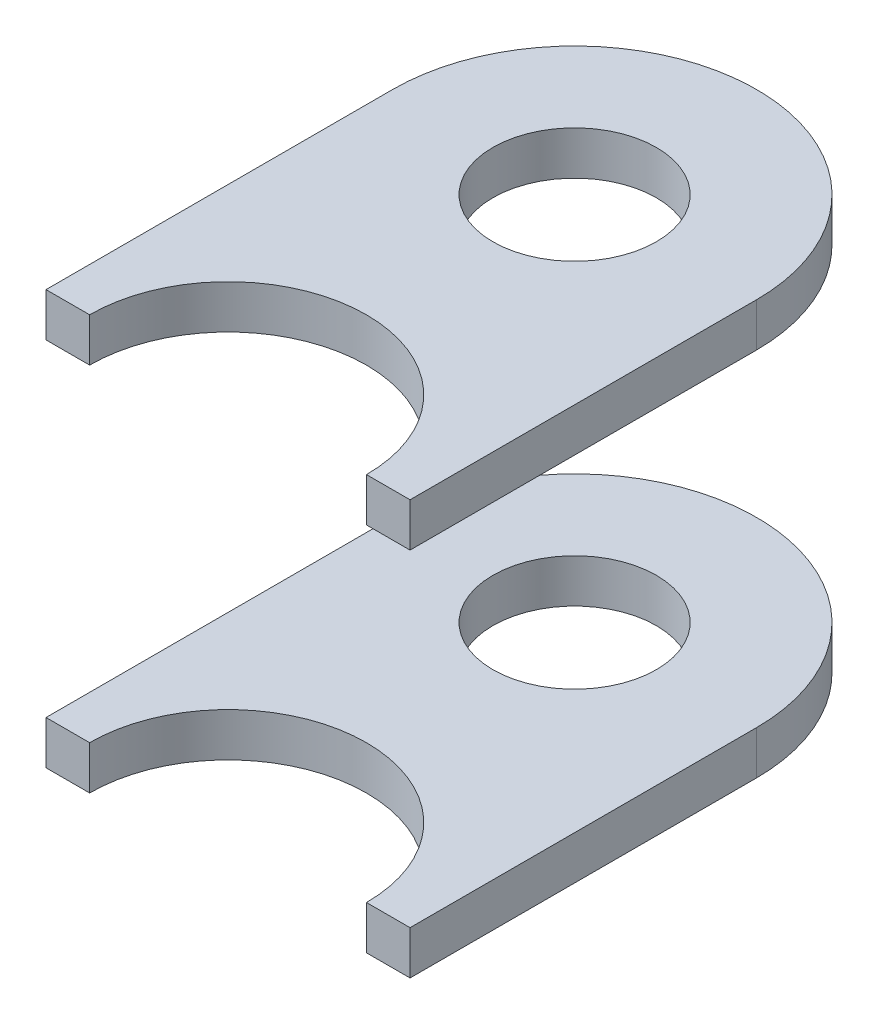
ISO-10303-21;
HEADER;
FILE_DESCRIPTION(('STEP AP214'),'2;1');
FILE_NAME('part.step','',(''),(''),'','','');
FILE_SCHEMA(('AUTOMOTIVE_DESIGN { 1 0 10303 214 1 1 1 1 }'));
ENDSEC;
DATA;
#1=APPLICATION_CONTEXT('core data for automotive mechanical design processes');
#2=APPLICATION_PROTOCOL_DEFINITION('international standard','automotive_design',2000,#1);
#3=PRODUCT_CONTEXT('',#1,'mechanical');
#4=PRODUCT('Part','Part','',(#3));
#5=PRODUCT_RELATED_PRODUCT_CATEGORY('part','',(#4));
#6=PRODUCT_DEFINITION_FORMATION('','',#4);
#7=PRODUCT_DEFINITION_CONTEXT('part definition',#1,'design');
#8=PRODUCT_DEFINITION('design','',#6,#7);
#9=PRODUCT_DEFINITION_SHAPE('','',#8);
#10=(LENGTH_UNIT() NAMED_UNIT(*) SI_UNIT(.MILLI.,.METRE.));
#11=(NAMED_UNIT(*) PLANE_ANGLE_UNIT() SI_UNIT($,.RADIAN.));
#12=(NAMED_UNIT(*) SI_UNIT($,.STERADIAN.) SOLID_ANGLE_UNIT());
#13=UNCERTAINTY_MEASURE_WITH_UNIT(LENGTH_MEASURE(1.E-05),#10,'distance_accuracy_value','');
#14=(GEOMETRIC_REPRESENTATION_CONTEXT(3) GLOBAL_UNCERTAINTY_ASSIGNED_CONTEXT((#13)) GLOBAL_UNIT_ASSIGNED_CONTEXT((#10,
#11,#12)) REPRESENTATION_CONTEXT('',''));
#15=CARTESIAN_POINT('',(0.,0.,0.));
#16=DIRECTION('',(0.,0.,1.));
#17=DIRECTION('',(1.,0.,0.));
#18=AXIS2_PLACEMENT_3D('',#15,#16,#17);
#19=CARTESIAN_POINT('',(0.,-19.,31.8));
#20=DIRECTION('',(0.,-1.,0.));
#21=DIRECTION('',(0.,0.,1.));
#22=AXIS2_PLACEMENT_3D('',#19,#20,#21);
#23=PLANE('',#22);
#24=DIRECTION('',(0.,0.,-1.));
#25=VECTOR('',#24,1.);
#26=CARTESIAN_POINT('',(16.7,-19.,0.));
#27=LINE('',#26,#25);
#28=CARTESIAN_POINT('',(16.7,-19.,31.8));
#29=VERTEX_POINT('',#28);
#30=CARTESIAN_POINT('',(16.7,-19.,0.));
#31=VERTEX_POINT('',#30);
#32=EDGE_CURVE('E149',#29,#31,#27,.T.);
#33=ORIENTED_EDGE('',*,*,#32,.F.);
#34=DIRECTION('',(1.,0.,0.));
#35=VECTOR('',#34,1.);
#36=CARTESIAN_POINT('',(16.7,-19.,31.8));
#37=LINE('',#36,#35);
#38=CARTESIAN_POINT('',(12.7,-19.,31.8));
#39=VERTEX_POINT('',#38);
#40=EDGE_CURVE('E129',#39,#29,#37,.T.);
#41=ORIENTED_EDGE('',*,*,#40,.F.);
#42=CARTESIAN_POINT('',(0.,-19.,31.8));
#43=DIRECTION('',(0.,-1.,0.));
#44=DIRECTION('',(0.,0.,1.));
#45=AXIS2_PLACEMENT_3D('',#42,#43,#44);
#46=CIRCLE('',#45,12.7);
#47=CARTESIAN_POINT('',(-12.7,-19.,31.8));
#48=VERTEX_POINT('',#47);
#49=EDGE_CURVE('E110',#48,#39,#46,.T.);
#50=ORIENTED_EDGE('',*,*,#49,.F.);
#51=DIRECTION('',(1.,0.,0.));
#52=VECTOR('',#51,1.);
#53=CARTESIAN_POINT('',(-12.7,-19.,31.8));
#54=LINE('',#53,#52);
#55=CARTESIAN_POINT('',(-16.7,-19.,31.8));
#56=VERTEX_POINT('',#55);
#57=EDGE_CURVE('E120',#56,#48,#54,.T.);
#58=ORIENTED_EDGE('',*,*,#57,.F.);
#59=DIRECTION('',(0.,0.,1.));
#60=VECTOR('',#59,1.);
#61=CARTESIAN_POINT('',(-16.7,-19.,31.8));
#62=LINE('',#61,#60);
#63=CARTESIAN_POINT('',(-16.7,-19.,0.));
#64=VERTEX_POINT('',#63);
#65=EDGE_CURVE('E125',#64,#56,#62,.T.);
#66=ORIENTED_EDGE('',*,*,#65,.F.);
#67=CARTESIAN_POINT('',(0.,-19.,0.));
#68=DIRECTION('',(0.,1.,0.));
#69=DIRECTION('',(0.,0.,-1.));
#70=AXIS2_PLACEMENT_3D('',#67,#68,#69);
#71=CIRCLE('',#70,16.7);
#72=EDGE_CURVE('E154',#31,#64,#71,.T.);
#73=ORIENTED_EDGE('',*,*,#72,.F.);
#74=EDGE_LOOP('',(#33,#41,#50,#58,#66,#73));
#75=FACE_BOUND('',#74,.T.);
#76=CARTESIAN_POINT('',(0.,-19.,0.));
#77=DIRECTION('',(0.,1.,0.));
#78=DIRECTION('',(0.,0.,1.));
#79=AXIS2_PLACEMENT_3D('',#76,#77,#78);
#80=CIRCLE('',#79,7.5);
#81=CARTESIAN_POINT('',(0.,-19.,7.5));
#82=VERTEX_POINT('',#81);
#83=EDGE_CURVE('E138',#82,#82,#80,.T.);
#84=ORIENTED_EDGE('',*,*,#83,.T.);
#85=EDGE_LOOP('',(#84));
#86=FACE_BOUND('',#85,.T.);
#87=ADVANCED_FACE('F49',(#75,#86),#23,.T.);
#88=CARTESIAN_POINT('',(0.,-15.,31.8));
#89=DIRECTION('',(0.,-1.,0.));
#90=DIRECTION('',(0.,0.,1.));
#91=AXIS2_PLACEMENT_3D('',#88,#89,#90);
#92=PLANE('',#91);
#93=DIRECTION('',(0.,0.,-1.));
#94=VECTOR('',#93,1.);
#95=CARTESIAN_POINT('',(16.7,-15.,0.));
#96=LINE('',#95,#94);
#97=CARTESIAN_POINT('',(16.7,-15.,31.8));
#98=VERTEX_POINT('',#97);
#99=CARTESIAN_POINT('',(16.7,-15.,0.));
#100=VERTEX_POINT('',#99);
#101=EDGE_CURVE('E134',#98,#100,#96,.T.);
#102=ORIENTED_EDGE('',*,*,#101,.T.);
#103=CARTESIAN_POINT('',(0.,-15.,0.));
#104=DIRECTION('',(0.,1.,0.));
#105=DIRECTION('',(0.,0.,-1.));
#106=AXIS2_PLACEMENT_3D('',#103,#104,#105);
#107=CIRCLE('',#106,16.7);
#108=CARTESIAN_POINT('',(-16.7,-15.,0.));
#109=VERTEX_POINT('',#108);
#110=EDGE_CURVE('E137',#100,#109,#107,.T.);
#111=ORIENTED_EDGE('',*,*,#110,.T.);
#112=DIRECTION('',(0.,0.,1.));
#113=VECTOR('',#112,1.);
#114=CARTESIAN_POINT('',(-16.7,-15.,31.8));
#115=LINE('',#114,#113);
#116=CARTESIAN_POINT('',(-16.7,-15.,31.8));
#117=VERTEX_POINT('',#116);
#118=EDGE_CURVE('E141',#109,#117,#115,.T.);
#119=ORIENTED_EDGE('',*,*,#118,.T.);
#120=DIRECTION('',(1.,0.,0.));
#121=VECTOR('',#120,1.);
#122=CARTESIAN_POINT('',(-12.7,-15.,31.8));
#123=LINE('',#122,#121);
#124=CARTESIAN_POINT('',(-12.7,-15.,31.8));
#125=VERTEX_POINT('',#124);
#126=EDGE_CURVE('E144',#117,#125,#123,.T.);
#127=ORIENTED_EDGE('',*,*,#126,.T.);
#128=CARTESIAN_POINT('',(0.,-15.,31.8));
#129=DIRECTION('',(0.,-1.,0.));
#130=DIRECTION('',(0.,0.,1.));
#131=AXIS2_PLACEMENT_3D('',#128,#129,#130);
#132=CIRCLE('',#131,12.7);
#133=CARTESIAN_POINT('',(12.7,-15.,31.8));
#134=VERTEX_POINT('',#133);
#135=EDGE_CURVE('E113',#125,#134,#132,.T.);
#136=ORIENTED_EDGE('',*,*,#135,.T.);
#137=DIRECTION('',(1.,0.,0.));
#138=VECTOR('',#137,1.);
#139=CARTESIAN_POINT('',(16.7,-15.,31.8));
#140=LINE('',#139,#138);
#141=EDGE_CURVE('E147',#134,#98,#140,.T.);
#142=ORIENTED_EDGE('',*,*,#141,.T.);
#143=EDGE_LOOP('',(#102,#111,#119,#127,#136,#142));
#144=FACE_BOUND('',#143,.T.);
#145=CARTESIAN_POINT('',(0.,-15.,0.));
#146=DIRECTION('',(0.,1.,0.));
#147=DIRECTION('',(0.,0.,1.));
#148=AXIS2_PLACEMENT_3D('',#145,#146,#147);
#149=CIRCLE('',#148,7.5);
#150=CARTESIAN_POINT('',(0.,-15.,7.5));
#151=VERTEX_POINT('',#150);
#152=EDGE_CURVE('E163',#151,#151,#149,.T.);
#153=ORIENTED_EDGE('',*,*,#152,.F.);
#154=EDGE_LOOP('',(#153));
#155=FACE_BOUND('',#154,.T.);
#156=ADVANCED_FACE('F158',(#144,#155),#92,.F.);
#157=CARTESIAN_POINT('',(16.7,-19.,0.));
#158=DIRECTION('',(-1.,0.,0.));
#159=DIRECTION('',(0.,0.,1.));
#160=AXIS2_PLACEMENT_3D('',#157,#158,#159);
#161=PLANE('',#160);
#162=ORIENTED_EDGE('',*,*,#101,.F.);
#163=DIRECTION('',(0.,1.,0.));
#164=VECTOR('',#163,1.);
#165=CARTESIAN_POINT('',(16.7,-19.,31.8));
#166=LINE('',#165,#164);
#167=EDGE_CURVE('E66',#29,#98,#166,.T.);
#168=ORIENTED_EDGE('',*,*,#167,.F.);
#169=ORIENTED_EDGE('',*,*,#32,.T.);
#170=DIRECTION('',(0.,1.,0.));
#171=VECTOR('',#170,1.);
#172=CARTESIAN_POINT('',(16.7,-19.,0.));
#173=LINE('',#172,#171);
#174=EDGE_CURVE('E12',#31,#100,#173,.T.);
#175=ORIENTED_EDGE('',*,*,#174,.T.);
#176=EDGE_LOOP('',(#162,#168,#169,#175));
#177=FACE_BOUND('',#176,.T.);
#178=ADVANCED_FACE('F51',(#177),#161,.F.);
#179=CARTESIAN_POINT('',(0.,-19.,0.));
#180=DIRECTION('',(0.,1.,0.));
#181=DIRECTION('',(0.,0.,-1.));
#182=AXIS2_PLACEMENT_3D('',#179,#180,#181);
#183=CYLINDRICAL_SURFACE('',#182,16.7);
#184=ORIENTED_EDGE('',*,*,#110,.F.);
#185=ORIENTED_EDGE('',*,*,#174,.F.);
#186=ORIENTED_EDGE('',*,*,#72,.T.);
#187=DIRECTION('',(0.,1.,0.));
#188=VECTOR('',#187,1.);
#189=CARTESIAN_POINT('',(-16.7,-19.,0.));
#190=LINE('',#189,#188);
#191=EDGE_CURVE('E58',#64,#109,#190,.T.);
#192=ORIENTED_EDGE('',*,*,#191,.T.);
#193=EDGE_LOOP('',(#184,#185,#186,#192));
#194=FACE_BOUND('',#193,.T.);
#195=ADVANCED_FACE('F153',(#194),#183,.T.);
#196=CARTESIAN_POINT('',(-16.7,-19.,31.8));
#197=DIRECTION('',(1.,0.,0.));
#198=DIRECTION('',(0.,0.,-1.));
#199=AXIS2_PLACEMENT_3D('',#196,#197,#198);
#200=PLANE('',#199);
#201=ORIENTED_EDGE('',*,*,#118,.F.);
#202=ORIENTED_EDGE('',*,*,#191,.F.);
#203=ORIENTED_EDGE('',*,*,#65,.T.);
#204=DIRECTION('',(0.,1.,0.));
#205=VECTOR('',#204,1.);
#206=CARTESIAN_POINT('',(-16.7,-19.,31.8));
#207=LINE('',#206,#205);
#208=EDGE_CURVE('E117',#56,#117,#207,.T.);
#209=ORIENTED_EDGE('',*,*,#208,.T.);
#210=EDGE_LOOP('',(#201,#202,#203,#209));
#211=FACE_BOUND('',#210,.T.);
#212=ADVANCED_FACE('F156',(#211),#200,.F.);
#213=CARTESIAN_POINT('',(-12.7,-19.,31.8));
#214=DIRECTION('',(0.,0.,-1.));
#215=DIRECTION('',(-1.,0.,0.));
#216=AXIS2_PLACEMENT_3D('',#213,#214,#215);
#217=PLANE('',#216);
#218=ORIENTED_EDGE('',*,*,#126,.F.);
#219=ORIENTED_EDGE('',*,*,#208,.F.);
#220=ORIENTED_EDGE('',*,*,#57,.T.);
#221=DIRECTION('',(0.,1.,0.));
#222=VECTOR('',#221,1.);
#223=CARTESIAN_POINT('',(-12.7,-19.,31.8));
#224=LINE('',#223,#222);
#225=EDGE_CURVE('E106',#48,#125,#224,.T.);
#226=ORIENTED_EDGE('',*,*,#225,.T.);
#227=EDGE_LOOP('',(#218,#219,#220,#226));
#228=FACE_BOUND('',#227,.T.);
#229=ADVANCED_FACE('F121',(#228),#217,.F.);
#230=CARTESIAN_POINT('',(0.,-19.,31.8));
#231=DIRECTION('',(0.,1.,0.));
#232=DIRECTION('',(0.,0.,-1.));
#233=AXIS2_PLACEMENT_3D('',#230,#231,#232);
#234=CYLINDRICAL_SURFACE('',#233,12.7);
#235=ORIENTED_EDGE('',*,*,#135,.F.);
#236=ORIENTED_EDGE('',*,*,#225,.F.);
#237=ORIENTED_EDGE('',*,*,#49,.T.);
#238=DIRECTION('',(0.,1.,0.));
#239=VECTOR('',#238,1.);
#240=CARTESIAN_POINT('',(12.7,-19.,31.8));
#241=LINE('',#240,#239);
#242=EDGE_CURVE('E88',#39,#134,#241,.T.);
#243=ORIENTED_EDGE('',*,*,#242,.T.);
#244=EDGE_LOOP('',(#235,#236,#237,#243));
#245=FACE_BOUND('',#244,.T.);
#246=ADVANCED_FACE('F108',(#245),#234,.F.);
#247=CARTESIAN_POINT('',(16.7,-19.,31.8));
#248=DIRECTION('',(0.,0.,-1.));
#249=DIRECTION('',(-1.,0.,0.));
#250=AXIS2_PLACEMENT_3D('',#247,#248,#249);
#251=PLANE('',#250);
#252=ORIENTED_EDGE('',*,*,#141,.F.);
#253=ORIENTED_EDGE('',*,*,#242,.F.);
#254=ORIENTED_EDGE('',*,*,#40,.T.);
#255=ORIENTED_EDGE('',*,*,#167,.T.);
#256=EDGE_LOOP('',(#252,#253,#254,#255));
#257=FACE_BOUND('',#256,.T.);
#258=ADVANCED_FACE('F172',(#257),#251,.F.);
#259=CARTESIAN_POINT('',(0.,-19.,0.));
#260=DIRECTION('',(0.,1.,0.));
#261=DIRECTION('',(0.,0.,-1.));
#262=AXIS2_PLACEMENT_3D('',#259,#260,#261);
#263=CYLINDRICAL_SURFACE('',#262,7.5);
#264=ORIENTED_EDGE('',*,*,#83,.F.);
#265=EDGE_LOOP('',(#264));
#266=FACE_BOUND('',#265,.T.);
#267=ORIENTED_EDGE('',*,*,#152,.T.);
#268=EDGE_LOOP('',(#267));
#269=FACE_BOUND('',#268,.T.);
#270=ADVANCED_FACE('F169',(#266,#269),#263,.F.);
#271=CLOSED_SHELL('',(#87,#156,#178,#195,#212,#229,#246,#258,#270));
#272=MANIFOLD_SOLID_BREP('B2',#271);
#273=CARTESIAN_POINT('',(0.,19.,31.8));
#274=DIRECTION('',(0.,1.,0.));
#275=DIRECTION('',(0.,0.,1.));
#276=AXIS2_PLACEMENT_3D('',#273,#274,#275);
#277=PLANE('',#276);
#278=DIRECTION('',(0.,0.,-1.));
#279=VECTOR('',#278,1.);
#280=CARTESIAN_POINT('',(16.7,19.,0.));
#281=LINE('',#280,#279);
#282=CARTESIAN_POINT('',(16.7,19.,31.8));
#283=VERTEX_POINT('',#282);
#284=CARTESIAN_POINT('',(16.7,19.,0.));
#285=VERTEX_POINT('',#284);
#286=EDGE_CURVE('E378',#283,#285,#281,.T.);
#287=ORIENTED_EDGE('',*,*,#286,.T.);
#288=CARTESIAN_POINT('',(0.,19.,0.));
#289=DIRECTION('',(0.,1.,0.));
#290=DIRECTION('',(0.,0.,-1.));
#291=AXIS2_PLACEMENT_3D('',#288,#289,#290);
#292=CIRCLE('',#291,16.7);
#293=CARTESIAN_POINT('',(-16.7,19.,0.));
#294=VERTEX_POINT('',#293);
#295=EDGE_CURVE('E336',#285,#294,#292,.T.);
#296=ORIENTED_EDGE('',*,*,#295,.T.);
#297=DIRECTION('',(0.,0.,1.));
#298=VECTOR('',#297,1.);
#299=CARTESIAN_POINT('',(-16.7,19.,31.8));
#300=LINE('',#299,#298);
#301=CARTESIAN_POINT('',(-16.7,19.,31.8));
#302=VERTEX_POINT('',#301);
#303=EDGE_CURVE('E349',#294,#302,#300,.T.);
#304=ORIENTED_EDGE('',*,*,#303,.T.);
#305=DIRECTION('',(1.,0.,0.));
#306=VECTOR('',#305,1.);
#307=CARTESIAN_POINT('',(-12.7,19.,31.8));
#308=LINE('',#307,#306);
#309=CARTESIAN_POINT('',(-12.7,19.,31.8));
#310=VERTEX_POINT('',#309);
#311=EDGE_CURVE('E343',#302,#310,#308,.T.);
#312=ORIENTED_EDGE('',*,*,#311,.T.);
#313=CARTESIAN_POINT('',(0.,19.,31.8));
#314=DIRECTION('',(0.,-1.,0.));
#315=DIRECTION('',(0.,0.,1.));
#316=AXIS2_PLACEMENT_3D('',#313,#314,#315);
#317=CIRCLE('',#316,12.7);
#318=CARTESIAN_POINT('',(12.7,19.,31.8));
#319=VERTEX_POINT('',#318);
#320=EDGE_CURVE('E347',#310,#319,#317,.T.);
#321=ORIENTED_EDGE('',*,*,#320,.T.);
#322=DIRECTION('',(1.,0.,0.));
#323=VECTOR('',#322,1.);
#324=CARTESIAN_POINT('',(16.7,19.,31.8));
#325=LINE('',#324,#323);
#326=EDGE_CURVE('E299',#319,#283,#325,.T.);
#327=ORIENTED_EDGE('',*,*,#326,.T.);
#328=EDGE_LOOP('',(#287,#296,#304,#312,#321,#327));
#329=FACE_BOUND('',#328,.T.);
#330=CARTESIAN_POINT('',(0.,19.,0.));
#331=DIRECTION('',(0.,1.,0.));
#332=DIRECTION('',(0.,0.,1.));
#333=AXIS2_PLACEMENT_3D('',#330,#331,#332);
#334=CIRCLE('',#333,7.5);
#335=CARTESIAN_POINT('',(0.,19.,7.5));
#336=VERTEX_POINT('',#335);
#337=EDGE_CURVE('E371',#336,#336,#334,.T.);
#338=ORIENTED_EDGE('',*,*,#337,.F.);
#339=EDGE_LOOP('',(#338));
#340=FACE_BOUND('',#339,.T.);
#341=ADVANCED_FACE('F282',(#329,#340),#277,.T.);
#342=CARTESIAN_POINT('',(0.,15.,31.8));
#343=DIRECTION('',(0.,1.,0.));
#344=DIRECTION('',(0.,0.,1.));
#345=AXIS2_PLACEMENT_3D('',#342,#343,#344);
#346=PLANE('',#345);
#347=DIRECTION('',(0.,0.,-1.));
#348=VECTOR('',#347,1.);
#349=CARTESIAN_POINT('',(16.7,15.,0.));
#350=LINE('',#349,#348);
#351=CARTESIAN_POINT('',(16.7,15.,31.8));
#352=VERTEX_POINT('',#351);
#353=CARTESIAN_POINT('',(16.7,15.,0.));
#354=VERTEX_POINT('',#353);
#355=EDGE_CURVE('E367',#352,#354,#350,.T.);
#356=ORIENTED_EDGE('',*,*,#355,.F.);
#357=DIRECTION('',(1.,0.,0.));
#358=VECTOR('',#357,1.);
#359=CARTESIAN_POINT('',(16.7,15.,31.8));
#360=LINE('',#359,#358);
#361=CARTESIAN_POINT('',(12.7,15.,31.8));
#362=VERTEX_POINT('',#361);
#363=EDGE_CURVE('E328',#362,#352,#360,.T.);
#364=ORIENTED_EDGE('',*,*,#363,.F.);
#365=CARTESIAN_POINT('',(0.,15.,31.8));
#366=DIRECTION('',(0.,-1.,0.));
#367=DIRECTION('',(0.,0.,1.));
#368=AXIS2_PLACEMENT_3D('',#365,#366,#367);
#369=CIRCLE('',#368,12.7);
#370=CARTESIAN_POINT('',(-12.7,15.,31.8));
#371=VERTEX_POINT('',#370);
#372=EDGE_CURVE('E322',#371,#362,#369,.T.);
#373=ORIENTED_EDGE('',*,*,#372,.F.);
#374=DIRECTION('',(1.,0.,0.));
#375=VECTOR('',#374,1.);
#376=CARTESIAN_POINT('',(-12.7,15.,31.8));
#377=LINE('',#376,#375);
#378=CARTESIAN_POINT('',(-16.7,15.,31.8));
#379=VERTEX_POINT('',#378);
#380=EDGE_CURVE('E357',#379,#371,#377,.T.);
#381=ORIENTED_EDGE('',*,*,#380,.F.);
#382=DIRECTION('',(0.,0.,1.));
#383=VECTOR('',#382,1.);
#384=CARTESIAN_POINT('',(-16.7,15.,31.8));
#385=LINE('',#384,#383);
#386=CARTESIAN_POINT('',(-16.7,15.,0.));
#387=VERTEX_POINT('',#386);
#388=EDGE_CURVE('E373',#387,#379,#385,.T.);
#389=ORIENTED_EDGE('',*,*,#388,.F.);
#390=CARTESIAN_POINT('',(0.,15.,0.));
#391=DIRECTION('',(0.,1.,0.));
#392=DIRECTION('',(0.,0.,-1.));
#393=AXIS2_PLACEMENT_3D('',#390,#391,#392);
#394=CIRCLE('',#393,16.7);
#395=EDGE_CURVE('E370',#354,#387,#394,.T.);
#396=ORIENTED_EDGE('',*,*,#395,.F.);
#397=EDGE_LOOP('',(#356,#364,#373,#381,#389,#396));
#398=FACE_BOUND('',#397,.T.);
#399=CARTESIAN_POINT('',(0.,15.,0.));
#400=DIRECTION('',(0.,1.,0.));
#401=DIRECTION('',(0.,0.,1.));
#402=AXIS2_PLACEMENT_3D('',#399,#400,#401);
#403=CIRCLE('',#402,7.5);
#404=CARTESIAN_POINT('',(0.,15.,7.5));
#405=VERTEX_POINT('',#404);
#406=EDGE_CURVE('E507',#405,#405,#403,.T.);
#407=ORIENTED_EDGE('',*,*,#406,.T.);
#408=EDGE_LOOP('',(#407));
#409=FACE_BOUND('',#408,.T.);
#410=ADVANCED_FACE('F387',(#398,#409),#346,.F.);
#411=CARTESIAN_POINT('',(16.7,19.,0.));
#412=DIRECTION('',(-1.,0.,0.));
#413=DIRECTION('',(0.,0.,1.));
#414=AXIS2_PLACEMENT_3D('',#411,#412,#413);
#415=PLANE('',#414);
#416=ORIENTED_EDGE('',*,*,#355,.T.);
#417=DIRECTION('',(0.,-1.,0.));
#418=VECTOR('',#417,1.);
#419=CARTESIAN_POINT('',(16.7,19.,0.));
#420=LINE('',#419,#418);
#421=EDGE_CURVE('E47',#285,#354,#420,.T.);
#422=ORIENTED_EDGE('',*,*,#421,.F.);
#423=ORIENTED_EDGE('',*,*,#286,.F.);
#424=DIRECTION('',(0.,-1.,0.));
#425=VECTOR('',#424,1.);
#426=CARTESIAN_POINT('',(16.7,19.,31.8));
#427=LINE('',#426,#425);
#428=EDGE_CURVE('E363',#283,#352,#427,.T.);
#429=ORIENTED_EDGE('',*,*,#428,.T.);
#430=EDGE_LOOP('',(#416,#422,#423,#429));
#431=FACE_BOUND('',#430,.T.);
#432=ADVANCED_FACE('F284',(#431),#415,.F.);
#433=CARTESIAN_POINT('',(0.,19.,0.));
#434=DIRECTION('',(0.,-1.,0.));
#435=DIRECTION('',(0.,0.,-1.));
#436=AXIS2_PLACEMENT_3D('',#433,#434,#435);
#437=CYLINDRICAL_SURFACE('',#436,16.7);
#438=ORIENTED_EDGE('',*,*,#395,.T.);
#439=DIRECTION('',(0.,-1.,0.));
#440=VECTOR('',#439,1.);
#441=CARTESIAN_POINT('',(-16.7,19.,0.));
#442=LINE('',#441,#440);
#443=EDGE_CURVE('E291',#294,#387,#442,.T.);
#444=ORIENTED_EDGE('',*,*,#443,.F.);
#445=ORIENTED_EDGE('',*,*,#295,.F.);
#446=ORIENTED_EDGE('',*,*,#421,.T.);
#447=EDGE_LOOP('',(#438,#444,#445,#446));
#448=FACE_BOUND('',#447,.T.);
#449=ADVANCED_FACE('F412',(#448),#437,.T.);
#450=CARTESIAN_POINT('',(-16.7,19.,31.8));
#451=DIRECTION('',(1.,0.,0.));
#452=DIRECTION('',(0.,0.,-1.));
#453=AXIS2_PLACEMENT_3D('',#450,#451,#452);
#454=PLANE('',#453);
#455=ORIENTED_EDGE('',*,*,#388,.T.);
#456=DIRECTION('',(0.,-1.,0.));
#457=VECTOR('',#456,1.);
#458=CARTESIAN_POINT('',(-16.7,19.,31.8));
#459=LINE('',#458,#457);
#460=EDGE_CURVE('E358',#302,#379,#459,.T.);
#461=ORIENTED_EDGE('',*,*,#460,.F.);
#462=ORIENTED_EDGE('',*,*,#303,.F.);
#463=ORIENTED_EDGE('',*,*,#443,.T.);
#464=EDGE_LOOP('',(#455,#461,#462,#463));
#465=FACE_BOUND('',#464,.T.);
#466=ADVANCED_FACE('F384',(#465),#454,.F.);
#467=CARTESIAN_POINT('',(-12.7,19.,31.8));
#468=DIRECTION('',(0.,0.,-1.));
#469=DIRECTION('',(-1.,0.,0.));
#470=AXIS2_PLACEMENT_3D('',#467,#468,#469);
#471=PLANE('',#470);
#472=ORIENTED_EDGE('',*,*,#380,.T.);
#473=DIRECTION('',(0.,-1.,0.));
#474=VECTOR('',#473,1.);
#475=CARTESIAN_POINT('',(-12.7,19.,31.8));
#476=LINE('',#475,#474);
#477=EDGE_CURVE('E354',#310,#371,#476,.T.);
#478=ORIENTED_EDGE('',*,*,#477,.F.);
#479=ORIENTED_EDGE('',*,*,#311,.F.);
#480=ORIENTED_EDGE('',*,*,#460,.T.);
#481=EDGE_LOOP('',(#472,#478,#479,#480));
#482=FACE_BOUND('',#481,.T.);
#483=ADVANCED_FACE('F355',(#482),#471,.F.);
#484=CARTESIAN_POINT('',(0.,19.,31.8));
#485=DIRECTION('',(0.,-1.,0.));
#486=DIRECTION('',(0.,0.,-1.));
#487=AXIS2_PLACEMENT_3D('',#484,#485,#486);
#488=CYLINDRICAL_SURFACE('',#487,12.7);
#489=ORIENTED_EDGE('',*,*,#372,.T.);
#490=DIRECTION('',(0.,-1.,0.));
#491=VECTOR('',#490,1.);
#492=CARTESIAN_POINT('',(12.7,19.,31.8));
#493=LINE('',#492,#491);
#494=EDGE_CURVE('E359',#319,#362,#493,.T.);
#495=ORIENTED_EDGE('',*,*,#494,.F.);
#496=ORIENTED_EDGE('',*,*,#320,.F.);
#497=ORIENTED_EDGE('',*,*,#477,.T.);
#498=EDGE_LOOP('',(#489,#495,#496,#497));
#499=FACE_BOUND('',#498,.T.);
#500=ADVANCED_FACE('F361',(#499),#488,.F.);
#501=CARTESIAN_POINT('',(16.7,19.,31.8));
#502=DIRECTION('',(0.,0.,-1.));
#503=DIRECTION('',(-1.,0.,0.));
#504=AXIS2_PLACEMENT_3D('',#501,#502,#503);
#505=PLANE('',#504);
#506=ORIENTED_EDGE('',*,*,#363,.T.);
#507=ORIENTED_EDGE('',*,*,#428,.F.);
#508=ORIENTED_EDGE('',*,*,#326,.F.);
#509=ORIENTED_EDGE('',*,*,#494,.T.);
#510=EDGE_LOOP('',(#506,#507,#508,#509));
#511=FACE_BOUND('',#510,.T.);
#512=ADVANCED_FACE('F392',(#511),#505,.F.);
#513=CARTESIAN_POINT('',(0.,19.,0.));
#514=DIRECTION('',(0.,-1.,0.));
#515=DIRECTION('',(0.,0.,-1.));
#516=AXIS2_PLACEMENT_3D('',#513,#514,#515);
#517=CYLINDRICAL_SURFACE('',#516,7.5);
#518=ORIENTED_EDGE('',*,*,#337,.T.);
#519=EDGE_LOOP('',(#518));
#520=FACE_BOUND('',#519,.T.);
#521=ORIENTED_EDGE('',*,*,#406,.F.);
#522=EDGE_LOOP('',(#521));
#523=FACE_BOUND('',#522,.T.);
#524=ADVANCED_FACE('F394',(#520,#523),#517,.F.);
#525=CLOSED_SHELL('',(#341,#410,#432,#449,#466,#483,#500,#512,#524));
#526=MANIFOLD_SOLID_BREP('B6',#525);
#527=ADVANCED_BREP_SHAPE_REPRESENTATION('',(#18,#272,#526),#14);
#528=SHAPE_DEFINITION_REPRESENTATION(#9,#527);
ENDSEC;
END-ISO-10303-21;
